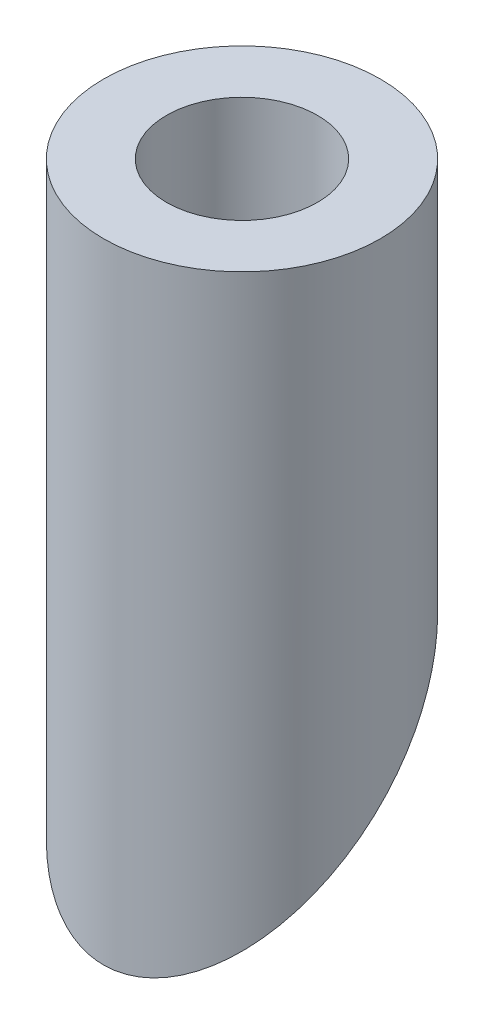
ISO-10303-21;
HEADER;
FILE_DESCRIPTION(('STEP AP214'),'2;1');
FILE_NAME('part.step','',(''),(''),'','','');
FILE_SCHEMA(('AUTOMOTIVE_DESIGN { 1 0 10303 214 1 1 1 1 }'));
ENDSEC;
DATA;
#1=APPLICATION_CONTEXT('core data for automotive mechanical design processes');
#2=APPLICATION_PROTOCOL_DEFINITION('international standard','automotive_design',2000,#1);
#3=PRODUCT_CONTEXT('',#1,'mechanical');
#4=PRODUCT('Part','Part','',(#3));
#5=PRODUCT_RELATED_PRODUCT_CATEGORY('part','',(#4));
#6=PRODUCT_DEFINITION_FORMATION('','',#4);
#7=PRODUCT_DEFINITION_CONTEXT('part definition',#1,'design');
#8=PRODUCT_DEFINITION('design','',#6,#7);
#9=PRODUCT_DEFINITION_SHAPE('','',#8);
#10=(LENGTH_UNIT() NAMED_UNIT(*) SI_UNIT(.MILLI.,.METRE.));
#11=(NAMED_UNIT(*) PLANE_ANGLE_UNIT() SI_UNIT($,.RADIAN.));
#12=(NAMED_UNIT(*) SI_UNIT($,.STERADIAN.) SOLID_ANGLE_UNIT());
#13=UNCERTAINTY_MEASURE_WITH_UNIT(LENGTH_MEASURE(1.E-05),#10,'distance_accuracy_value','');
#14=(GEOMETRIC_REPRESENTATION_CONTEXT(3) GLOBAL_UNCERTAINTY_ASSIGNED_CONTEXT((#13)) GLOBAL_UNIT_ASSIGNED_CONTEXT((#10,
#11,#12)) REPRESENTATION_CONTEXT('',''));
#15=CARTESIAN_POINT('',(0.,0.,0.));
#16=DIRECTION('',(0.,0.,1.));
#17=DIRECTION('',(1.,0.,0.));
#18=AXIS2_PLACEMENT_3D('',#15,#16,#17);
#19=CARTESIAN_POINT('',(0.,50.,0.));
#20=DIRECTION('',(0.,1.,0.));
#21=DIRECTION('',(0.,0.,1.));
#22=AXIS2_PLACEMENT_3D('',#19,#20,#21);
#23=PLANE('',#22);
#24=CARTESIAN_POINT('',(0.,50.,0.));
#25=DIRECTION('',(0.,1.,0.));
#26=DIRECTION('',(0.,0.,1.));
#27=AXIS2_PLACEMENT_3D('',#24,#25,#26);
#28=CIRCLE('',#27,11.);
#29=CARTESIAN_POINT('',(0.,50.,11.));
#30=VERTEX_POINT('',#29);
#31=EDGE_CURVE('E12',#30,#30,#28,.T.);
#32=ORIENTED_EDGE('',*,*,#31,.T.);
#33=EDGE_LOOP('',(#32));
#34=FACE_BOUND('',#33,.T.);
#35=CARTESIAN_POINT('',(0.,50.,0.));
#36=DIRECTION('',(0.,1.,0.));
#37=DIRECTION('',(0.,0.,1.));
#38=AXIS2_PLACEMENT_3D('',#35,#36,#37);
#39=CIRCLE('',#38,6.);
#40=CARTESIAN_POINT('',(0.,50.,6.));
#41=VERTEX_POINT('',#40);
#42=EDGE_CURVE('E59',#41,#41,#39,.T.);
#43=ORIENTED_EDGE('',*,*,#42,.F.);
#44=EDGE_LOOP('',(#43));
#45=FACE_BOUND('',#44,.T.);
#46=ADVANCED_FACE('F50',(#34,#45),#23,.T.);
#47=CARTESIAN_POINT('',(0.,50.,0.));
#48=DIRECTION('',(0.,-1.,0.));
#49=DIRECTION('',(0.,0.,-1.));
#50=AXIS2_PLACEMENT_3D('',#47,#48,#49);
#51=CYLINDRICAL_SURFACE('',#50,11.);
#52=ORIENTED_EDGE('',*,*,#31,.F.);
#53=EDGE_LOOP('',(#52));
#54=FACE_BOUND('',#53,.T.);
#55=CARTESIAN_POINT('',(0.,11.,0.));
#56=DIRECTION('',(0.,0.707106781186546,0.707106781186549));
#57=DIRECTION('',(0.,-0.707106781186549,0.707106781186546));
#58=AXIS2_PLACEMENT_3D('',#55,#56,#57);
#59=ELLIPSE('',#58,15.5563491861041,11.);
#60=CARTESIAN_POINT('',(0.,0.,11.));
#61=VERTEX_POINT('',#60);
#62=EDGE_CURVE('E64',#61,#61,#59,.T.);
#63=ORIENTED_EDGE('',*,*,#62,.T.);
#64=EDGE_LOOP('',(#63));
#65=FACE_BOUND('',#64,.T.);
#66=ADVANCED_FACE('F52',(#54,#65),#51,.T.);
#67=CARTESIAN_POINT('',(0.,50.,0.));
#68=DIRECTION('',(0.,-1.,0.));
#69=DIRECTION('',(0.,0.,-1.));
#70=AXIS2_PLACEMENT_3D('',#67,#68,#69);
#71=CYLINDRICAL_SURFACE('',#70,6.);
#72=CARTESIAN_POINT('',(0.,11.,0.));
#73=DIRECTION('',(0.,0.707106781186546,0.707106781186549));
#74=DIRECTION('',(0.,-0.707106781186549,0.707106781186546));
#75=AXIS2_PLACEMENT_3D('',#72,#73,#74);
#76=ELLIPSE('',#75,8.48528137423859,6.);
#77=CARTESIAN_POINT('',(0.,5.00000000000001,6.));
#78=VERTEX_POINT('',#77);
#79=EDGE_CURVE('E54',#78,#78,#76,.T.);
#80=ORIENTED_EDGE('',*,*,#79,.F.);
#81=EDGE_LOOP('',(#80));
#82=FACE_BOUND('',#81,.T.);
#83=ORIENTED_EDGE('',*,*,#42,.T.);
#84=EDGE_LOOP('',(#83));
#85=FACE_BOUND('',#84,.T.);
#86=ADVANCED_FACE('F78',(#82,#85),#71,.F.);
#87=CARTESIAN_POINT('',(-11.,0.,11.));
#88=DIRECTION('',(0.,0.707106781186546,0.707106781186549));
#89=DIRECTION('',(0.,-0.707106781186549,0.707106781186546));
#90=AXIS2_PLACEMENT_3D('',#87,#88,#89);
#91=PLANE('',#90);
#92=ORIENTED_EDGE('',*,*,#79,.T.);
#93=EDGE_LOOP('',(#92));
#94=FACE_BOUND('',#93,.T.);
#95=ORIENTED_EDGE('',*,*,#62,.F.);
#96=EDGE_LOOP('',(#95));
#97=FACE_BOUND('',#96,.T.);
#98=ADVANCED_FACE('F75',(#94,#97),#91,.F.);
#99=CLOSED_SHELL('',(#46,#66,#86,#98));
#100=MANIFOLD_SOLID_BREP('B2',#99);
#101=ADVANCED_BREP_SHAPE_REPRESENTATION('',(#18,#100),#14);
#102=SHAPE_DEFINITION_REPRESENTATION(#9,#101);
ENDSEC;
END-ISO-10303-21;
